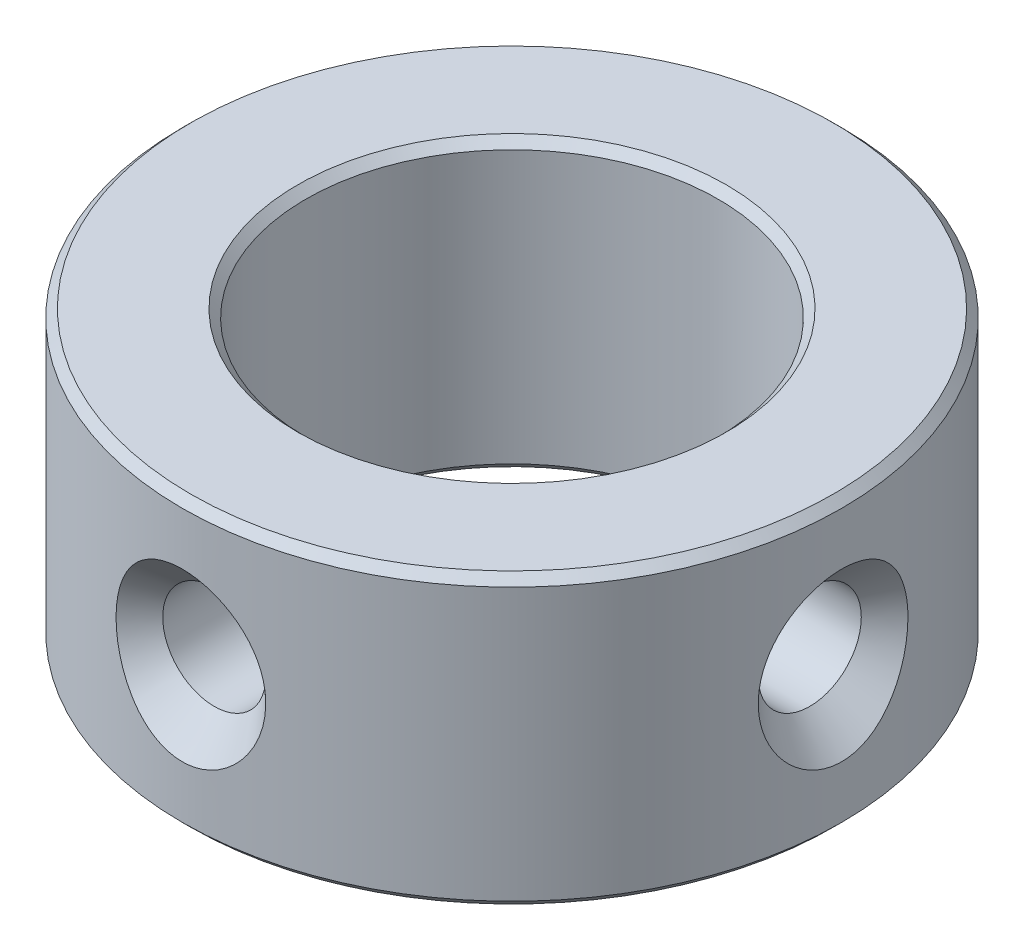
ISO-10303-21;
HEADER;
FILE_DESCRIPTION(('STEP AP214'),'2;1');
FILE_NAME('part.step','',(''),(''),'','','');
FILE_SCHEMA(('AUTOMOTIVE_DESIGN { 1 0 10303 214 1 1 1 1 }'));
ENDSEC;
DATA;
#1=APPLICATION_CONTEXT('core data for automotive mechanical design processes');
#2=APPLICATION_PROTOCOL_DEFINITION('international standard','automotive_design',2000,#1);
#3=PRODUCT_CONTEXT('',#1,'mechanical');
#4=PRODUCT('Part','Part','',(#3));
#5=PRODUCT_RELATED_PRODUCT_CATEGORY('part','',(#4));
#6=PRODUCT_DEFINITION_FORMATION('','',#4);
#7=PRODUCT_DEFINITION_CONTEXT('part definition',#1,'design');
#8=PRODUCT_DEFINITION('design','',#6,#7);
#9=PRODUCT_DEFINITION_SHAPE('','',#8);
#10=(LENGTH_UNIT() NAMED_UNIT(*) SI_UNIT(.MILLI.,.METRE.));
#11=(NAMED_UNIT(*) PLANE_ANGLE_UNIT() SI_UNIT($,.RADIAN.));
#12=(NAMED_UNIT(*) SI_UNIT($,.STERADIAN.) SOLID_ANGLE_UNIT());
#13=UNCERTAINTY_MEASURE_WITH_UNIT(LENGTH_MEASURE(1.E-05),#10,'distance_accuracy_value','');
#14=(GEOMETRIC_REPRESENTATION_CONTEXT(3) GLOBAL_UNCERTAINTY_ASSIGNED_CONTEXT((#13)) GLOBAL_UNIT_ASSIGNED_CONTEXT((#10,
#11,#12)) REPRESENTATION_CONTEXT('',''));
#15=CARTESIAN_POINT('',(0.,0.,0.));
#16=DIRECTION('',(0.,0.,1.));
#17=DIRECTION('',(1.,0.,0.));
#18=AXIS2_PLACEMENT_3D('',#15,#16,#17);
#19=CARTESIAN_POINT('',(0.,3.5,0.));
#20=DIRECTION('',(0.,1.,0.));
#21=DIRECTION('',(0.,0.,1.));
#22=AXIS2_PLACEMENT_3D('',#19,#20,#21);
#23=PLANE('',#22);
#24=CARTESIAN_POINT('',(0.,3.5,0.));
#25=DIRECTION('',(0.,1.,0.));
#26=DIRECTION('',(0.,0.,1.));
#27=AXIS2_PLACEMENT_3D('',#24,#25,#26);
#28=CIRCLE('',#27,5.19999999999999);
#29=CARTESIAN_POINT('',(0.,3.5,5.19999999999999));
#30=VERTEX_POINT('',#29);
#31=EDGE_CURVE('E39',#30,#30,#28,.F.);
#32=ORIENTED_EDGE('',*,*,#31,.T.);
#33=EDGE_LOOP('',(#32));
#34=FACE_BOUND('',#33,.T.);
#35=CARTESIAN_POINT('',(0.,3.5,0.));
#36=DIRECTION('',(0.,1.,0.));
#37=DIRECTION('',(0.,0.,1.));
#38=AXIS2_PLACEMENT_3D('',#35,#36,#37);
#39=CIRCLE('',#38,7.79999999999999);
#40=CARTESIAN_POINT('',(0.,3.5,7.79999999999999));
#41=VERTEX_POINT('',#40);
#42=EDGE_CURVE('E61',#41,#41,#39,.T.);
#43=ORIENTED_EDGE('',*,*,#42,.T.);
#44=EDGE_LOOP('',(#43));
#45=FACE_BOUND('',#44,.T.);
#46=ADVANCED_FACE('F32',(#34,#45),#23,.T.);
#47=CARTESIAN_POINT('',(0.,-3.5,0.));
#48=DIRECTION('',(0.,1.,0.));
#49=DIRECTION('',(0.,0.,1.));
#50=AXIS2_PLACEMENT_3D('',#47,#48,#49);
#51=PLANE('',#50);
#52=CARTESIAN_POINT('',(0.,-3.5,0.));
#53=DIRECTION('',(0.,1.,0.));
#54=DIRECTION('',(0.,0.,1.));
#55=AXIS2_PLACEMENT_3D('',#52,#53,#54);
#56=CIRCLE('',#55,5.2);
#57=CARTESIAN_POINT('',(0.,-3.5,5.2));
#58=VERTEX_POINT('',#57);
#59=EDGE_CURVE('E10',#58,#58,#56,.T.);
#60=ORIENTED_EDGE('',*,*,#59,.T.);
#61=EDGE_LOOP('',(#60));
#62=FACE_BOUND('',#61,.T.);
#63=CARTESIAN_POINT('',(0.,-3.5,0.));
#64=DIRECTION('',(0.,1.,0.));
#65=DIRECTION('',(0.,0.,1.));
#66=AXIS2_PLACEMENT_3D('',#63,#64,#65);
#67=CIRCLE('',#66,7.80000000000001);
#68=CARTESIAN_POINT('',(0.,-3.5,7.80000000000001));
#69=VERTEX_POINT('',#68);
#70=EDGE_CURVE('E52',#69,#69,#67,.F.);
#71=ORIENTED_EDGE('',*,*,#70,.T.);
#72=EDGE_LOOP('',(#71));
#73=FACE_BOUND('',#72,.T.);
#74=ADVANCED_FACE('F130',(#62,#73),#51,.F.);
#75=CARTESIAN_POINT('',(0.,3.5,0.));
#76=DIRECTION('',(0.,-1.,0.));
#77=DIRECTION('',(0.,0.,-1.));
#78=AXIS2_PLACEMENT_3D('',#75,#76,#77);
#79=CYLINDRICAL_SURFACE('',#78,8.);
#80=CARTESIAN_POINT('',(0.,3.3,0.));
#81=DIRECTION('',(0.,1.,0.));
#82=DIRECTION('',(0.,0.,1.));
#83=AXIS2_PLACEMENT_3D('',#80,#81,#82);
#84=CIRCLE('',#83,8.);
#85=CARTESIAN_POINT('',(0.,3.3,8.));
#86=VERTEX_POINT('',#85);
#87=EDGE_CURVE('E55',#86,#86,#84,.F.);
#88=ORIENTED_EDGE('',*,*,#87,.T.);
#89=EDGE_LOOP('',(#88));
#90=FACE_BOUND('',#89,.T.);
#91=CARTESIAN_POINT('',(0.,-3.30000000000001,0.));
#92=DIRECTION('',(0.,1.,0.));
#93=DIRECTION('',(0.,0.,1.));
#94=AXIS2_PLACEMENT_3D('',#91,#92,#93);
#95=CIRCLE('',#94,8.);
#96=CARTESIAN_POINT('',(0.,-3.30000000000001,8.));
#97=VERTEX_POINT('',#96);
#98=EDGE_CURVE('E58',#97,#97,#95,.T.);
#99=ORIENTED_EDGE('',*,*,#98,.T.);
#100=EDGE_LOOP('',(#99));
#101=FACE_BOUND('',#100,.T.);
#102=CARTESIAN_POINT('',(7.88766209710644,-1.36875477162574,-1.33595908059685));
#103=CARTESIAN_POINT('',(7.89781103552231,-1.4414286252341,-1.27603429818053));
#104=CARTESIAN_POINT('',(7.9081383203946,-1.50978786630845,-1.21092410711809));
#105=CARTESIAN_POINT('',(7.92828191149792,-1.63607735216326,-1.07113510455608));
#106=CARTESIAN_POINT('',(7.93809813738137,-1.69400596056068,-0.996454794813211));
#107=CARTESIAN_POINT('',(7.95751422673259,-1.80433598658457,-0.82826782927322));
#108=CARTESIAN_POINT('',(7.96691365686026,-1.85499227238431,-0.733577596470894));
#109=CARTESIAN_POINT('',(7.98262802779765,-1.93766030736591,-0.536115324437245));
#110=CARTESIAN_POINT('',(7.98894453445798,-1.96968152309718,-0.433347418805303));
#111=CARTESIAN_POINT('',(7.99710073240273,-2.01068415148824,-0.23484798397614));
#112=CARTESIAN_POINT('',(7.99935364163613,-2.02179796873598,-0.139571921445624));
#113=CARTESIAN_POINT('',(8.00040363119947,-2.02700021754694,0.0514400614488392));
#114=CARTESIAN_POINT('',(7.99920234256942,-2.02109668454089,0.147175743471714));
#115=CARTESIAN_POINT('',(7.99368299064805,-1.99353971527391,0.329953566160029));
#116=CARTESIAN_POINT('',(7.9895688820307,-1.97291623624104,0.417160436768698));
#117=CARTESIAN_POINT('',(7.97888924550496,-1.91805545357474,0.587003410573509));
#118=CARTESIAN_POINT('',(7.97232343057071,-1.88381655592824,0.669638977297495));
#119=CARTESIAN_POINT('',(7.95710684785922,-1.80164350628636,0.831447410075856));
#120=CARTESIAN_POINT('',(7.94838797996038,-1.75324988355686,0.910379354598936));
#121=CARTESIAN_POINT('',(7.92983729290104,-1.6451308494406,1.05989021924767));
#122=CARTESIAN_POINT('',(7.92000506202472,-1.58540124050917,1.13046602945358));
#123=CARTESIAN_POINT('',(7.89904582660171,-1.44972085183377,1.26905013470467));
#124=CARTESIAN_POINT('',(7.88789016769,-1.37273086647628,1.33603598461256));
#125=CARTESIAN_POINT('',(7.86633104820933,-1.20943589442853,1.45762002275963));
#126=CARTESIAN_POINT('',(7.85592793182822,-1.12312668986166,1.51221256681801));
#127=CARTESIAN_POINT('',(7.83578793922178,-0.93368420899724,1.61350064058194));
#128=CARTESIAN_POINT('',(7.82624234283822,-0.829739423354949,1.65872015787152));
#129=CARTESIAN_POINT('',(7.81024152158719,-0.615871494503479,1.73249973497609));
#130=CARTESIAN_POINT('',(7.80378723176595,-0.505946553622556,1.76105475474934));
#131=CARTESIAN_POINT('',(7.79436134890836,-0.275892694392124,1.80233745826448));
#132=CARTESIAN_POINT('',(7.79163227947352,-0.155555128118529,1.81396600486697));
#133=CARTESIAN_POINT('',(7.79075198907839,0.0854484195993427,1.81774165483045));
#134=CARTESIAN_POINT('',(7.79260142633618,0.206114445772796,1.80988595708527));
#135=CARTESIAN_POINT('',(7.80073010419386,0.446462607960986,1.77452638700267));
#136=CARTESIAN_POINT('',(7.80708299513201,0.566094443952362,1.74669574483184));
#137=CARTESIAN_POINT('',(7.82352991811995,0.798812680569081,1.67148212646728));
#138=CARTESIAN_POINT('',(7.83362448482233,0.911898143103936,1.62409635590782));
#139=CARTESIAN_POINT('',(7.85617363239958,1.12669357222183,1.51122432056163));
#140=CARTESIAN_POINT('',(7.86859876143102,1.22852268664282,1.44595970482076));
#141=CARTESIAN_POINT('',(7.89432126386702,1.41874134213551,1.29818903130757));
#142=CARTESIAN_POINT('',(7.90761843747953,1.50713394632294,1.21568691337547));
#143=CARTESIAN_POINT('',(7.93246835686329,1.66164276505291,1.04078913858743));
#144=CARTESIAN_POINT('',(7.94407815821557,1.72880219702167,0.949327337948772));
#145=CARTESIAN_POINT('',(7.96488454393579,1.84449878027027,0.75505110273021));
#146=CARTESIAN_POINT('',(7.97408378449348,1.89305645626681,0.652249342689261));
#147=CARTESIAN_POINT('',(7.98781799736742,1.96410335505809,0.451312314382522));
#148=CARTESIAN_POINT('',(7.99277458387603,1.98898855876391,0.354052486579373));
#149=CARTESIAN_POINT('',(7.99907701746182,2.02048546971918,0.156518181978604));
#150=CARTESIAN_POINT('',(8.00042540587232,2.02711003843476,0.0562458772972288));
#151=CARTESIAN_POINT('',(7.99938737297754,2.0219633323722,-0.134198642407214));
#152=CARTESIAN_POINT('',(7.99734430450829,2.01188339897859,-0.224423563772955));
#153=CARTESIAN_POINT('',(7.9903942901181,1.97699091937715,-0.401846849952557));
#154=CARTESIAN_POINT('',(7.98548742070105,1.95217876672711,-0.489045295550093));
#155=CARTESIAN_POINT('',(7.97332454700744,1.88894773394321,-0.658264871636935));
#156=CARTESIAN_POINT('',(7.96606573126401,1.85051256395271,-0.740279664771153));
#157=CARTESIAN_POINT('',(7.94991188720068,1.76159513342432,-0.897296732263518));
#158=CARTESIAN_POINT('',(7.94101638844481,1.71110940792094,-0.972296981040615));
#159=CARTESIAN_POINT('',(7.92157193605069,1.59495716503667,-1.12014915077485));
#160=CARTESIAN_POINT('',(7.91094652467704,1.52835569107497,-1.19225509057204));
#161=CARTESIAN_POINT('',(7.88970028540527,1.3850478979987,-1.32559327499721));
#162=CARTESIAN_POINT('',(7.8790794618174,1.3083369773454,-1.38682053797296));
#163=CARTESIAN_POINT('',(7.85762078250014,1.13766188456213,-1.50390740767079));
#164=CARTESIAN_POINT('',(7.84689440284181,1.04272763375916,-1.55837528669649));
#165=CARTESIAN_POINT('',(7.82769050557062,0.84543146813027,-1.65213681460813));
#166=CARTESIAN_POINT('',(7.8192138177182,0.743066830411459,-1.6914248671027));
#167=CARTESIAN_POINT('',(7.80478430221019,0.524863604563807,-1.75686338199667));
#168=CARTESIAN_POINT('',(7.79909327018633,0.408606654116868,-1.78168318673132));
#169=CARTESIAN_POINT('',(7.79197635299638,0.173492979797698,-1.81255498281006));
#170=CARTESIAN_POINT('',(7.79055134553896,0.0546357259951674,-1.81860311200533));
#171=CARTESIAN_POINT('',(7.79215470775396,-0.186141621833518,-1.8117236426872));
#172=CARTESIAN_POINT('',(7.79532022640392,-0.3080445698037,-1.798211677968));
#173=CARTESIAN_POINT('',(7.80597801834868,-0.547809265324001,-1.75136478762981));
#174=CARTESIAN_POINT('',(7.8134705945402,-0.665670729355821,-1.71802847428931));
#175=CARTESIAN_POINT('',(7.8312724761171,-0.886476919953176,-1.63488431518882));
#176=CARTESIAN_POINT('',(7.84136838501597,-0.989893398972423,-1.58628057084264));
#177=CARTESIAN_POINT('',(7.86344487841383,-1.18721070545209,-1.47294161599396));
#178=CARTESIAN_POINT('',(7.87542381944766,-1.28111971438651,-1.40822044388443));
#179=CARTESIAN_POINT('',(7.88766209710644,-1.36875477162574,-1.33595908059685));
#180=B_SPLINE_CURVE_WITH_KNOTS('',3,(#102,#103,#104,#105,#106,#107,#108,#109,#110,#111,#112,
#113,#114,#115,#116,#117,#118,#119,#120,#121,#122,#123,#124,#125,#126,#127,#128,#129,#130,#131,
#132,#133,#134,#135,#136,#137,#138,#139,#140,#141,#142,#143,#144,#145,#146,#147,#148,#149,#150,
#151,#152,#153,#154,#155,#156,#157,#158,#159,#160,#161,#162,#163,#164,#165,#166,#167,#168,#169,
#170,#171,#172,#173,#174,#175,#176,#177,#178,#179),.UNSPECIFIED.,.T.,.F.,(4,2,2,2,2,2,2,2,2,2,2,
2,2,2,2,2,2,2,2,2,2,2,2,2,2,2,2,2,2,2,2,2,2,2,2,2,2,2,4),(0.,0.28392792508048,0.567900354728612,
0.889441564156719,1.21081928888797,1.49713661535159,1.78331876764973,2.05122371140816,
2.31916002913897,2.59700085456465,2.87494476169208,3.18166689060421,3.48852842845147,
3.82831813350909,4.16821055201301,4.52931795360845,4.89047727196195,5.25768352956956,
5.62494227796447,5.98783937900106,6.35065362606252,6.6909135976671,7.03079704602511,
7.33066674892744,7.63032519134012,7.90145447436058,8.1725765147356,8.44402385178972,
8.71554933387908,9.01054345437876,9.3056723147691,9.63420252002207,9.96285373016412,
10.3182729082458,10.6737652066411,11.0400996569853,11.4064597540761,11.7491367222369,
12.0915162539504),.UNSPECIFIED.);
#181=CARTESIAN_POINT('',(7.88766209710644,-1.36875477162574,-1.33595908059685));
#182=VERTEX_POINT('',#181);
#183=EDGE_CURVE('E64',#182,#182,#180,.T.);
#184=ORIENTED_EDGE('',*,*,#183,.T.);
#185=EDGE_LOOP('',(#184));
#186=FACE_BOUND('',#185,.T.);
#187=CARTESIAN_POINT('',(-1.33595908059682,-1.36875477162574,7.88766209710644));
#188=CARTESIAN_POINT('',(-1.40944303777153,-1.27963328124012,7.87521663060979));
#189=CARTESIAN_POINT('',(-1.4751754482527,-1.18396169283024,7.8630310480242));
#190=CARTESIAN_POINT('',(-1.58998478810417,-0.982768950640019,7.8406243495173));
#191=CARTESIAN_POINT('',(-1.63903097970948,-0.877230071127629,7.83040687390907));
#192=CARTESIAN_POINT('',(-1.7197846566863,-0.659040217468571,7.81306964438267));
#193=CARTESIAN_POINT('',(-1.75142909299779,-0.546365009691055,7.80596117361972));
#194=CARTESIAN_POINT('',(-1.7966083868814,-0.317327894439627,7.79568713804951));
#195=CARTESIAN_POINT('',(-1.81015004894302,-0.20096738904467,7.79252009176648));
#196=CARTESIAN_POINT('',(-1.81912690093356,0.0375541003684798,7.79043051240186));
#197=CARTESIAN_POINT('',(-1.81375255546961,0.159748051786066,7.7916977364872));
#198=CARTESIAN_POINT('',(-1.78316985558781,0.401526905792244,7.79875284080626));
#199=CARTESIAN_POINT('',(-1.7579562950191,0.521111115072941,7.80454190764629));
#200=CARTESIAN_POINT('',(-1.68797509817015,0.754678135856541,7.81997590276495));
#201=CARTESIAN_POINT('',(-1.64313222537074,0.868637499222224,7.82963565468714));
#202=CARTESIAN_POINT('',(-1.53459227889633,1.08697091740285,7.85162918503102));
#203=CARTESIAN_POINT('',(-1.47089394056544,1.19134432866246,7.86396314279966));
#204=CARTESIAN_POINT('',(-1.32787380544344,1.38394389747925,7.88935093709948));
#205=CARTESIAN_POINT('',(-1.24906617594473,1.47255445402449,7.9023729646794));
#206=CARTESIAN_POINT('',(-1.07624454948179,1.63361969726082,7.92775432716441));
#207=CARTESIAN_POINT('',(-0.982240552060119,1.70608493385718,7.94011409078095));
#208=CARTESIAN_POINT('',(-0.79061247210154,1.82538818356649,7.96136628250515));
#209=CARTESIAN_POINT('',(-0.69409294335025,1.87395619323951,7.97047169136296));
#210=CARTESIAN_POINT('',(-0.493362812086154,1.95187494459024,7.98540336949179));
#211=CARTESIAN_POINT('',(-0.389160830878532,1.98124687368938,7.99123325307974));
#212=CARTESIAN_POINT('',(-0.189694909948285,2.01661473852397,7.99829721116927));
#213=CARTESIAN_POINT('',(-0.0948670486129899,2.02500106783029,8.0000004438111));
#214=CARTESIAN_POINT('',(0.0947751515084338,2.02499893199174,7.99999955623128));
#215=CARTESIAN_POINT('',(0.189589483759011,2.01661622526808,7.99829660567961));
#216=CARTESIAN_POINT('',(0.370809730932551,1.98451694841217,7.99188722859812));
#217=CARTESIAN_POINT('',(0.457385809552344,1.96170874588219,7.98735892720726));
#218=CARTESIAN_POINT('',(0.625658222200896,1.90269415719664,7.97594322581105));
#219=CARTESIAN_POINT('',(0.707353931616675,1.86648606030711,7.96905552459485));
#220=CARTESIAN_POINT('',(0.867569492170292,1.78026547187512,7.95324421338002));
#221=CARTESIAN_POINT('',(0.945791217111726,1.72971545485633,7.9442443268816));
#222=CARTESIAN_POINT('',(1.09358950647522,1.61742972276801,7.92525239714604));
#223=CARTESIAN_POINT('',(1.16316271346547,1.55568968635356,7.91525997128766));
#224=CARTESIAN_POINT('',(1.29954042216669,1.41578666349428,7.89407723621862));
#225=CARTESIAN_POINT('',(1.36526761175843,1.33657615589086,7.88287233695986));
#226=CARTESIAN_POINT('',(1.48400187279958,1.16902916281141,7.86138577229738));
#227=CARTESIAN_POINT('',(1.53700319890389,1.08068858102978,7.85110452520086));
#228=CARTESIAN_POINT('',(1.63450481137137,0.887403707645067,7.83141963516629));
#229=CARTESIAN_POINT('',(1.67752592730855,0.781690202917847,7.82222183509354));
#230=CARTESIAN_POINT('',(1.74661069991577,0.564638279797977,7.80708679845405));
#231=CARTESIAN_POINT('',(1.77266951557473,0.453298265370823,7.80115049278747));
#232=CARTESIAN_POINT('',(1.80845440681822,0.221213054972745,7.79293665356938));
#233=CARTESIAN_POINT('',(1.81714026649163,0.100297867187098,7.79089247887507));
#234=CARTESIAN_POINT('',(1.81492795759776,-0.14135115663399,7.79140775037289));
#235=CARTESIAN_POINT('',(1.80402704622598,-0.262084964900686,7.7939678413166));
#236=CARTESIAN_POINT('',(1.76252654275359,-0.501730670074366,7.80345808549174));
#237=CARTESIAN_POINT('',(1.7316488081271,-0.620592183231181,7.81044991465534));
#238=CARTESIAN_POINT('',(1.65043457115164,-0.851232621719874,7.82801267019195));
#239=CARTESIAN_POINT('',(1.60009536179655,-0.963010559238733,7.83858409444561));
#240=CARTESIAN_POINT('',(1.48165145405798,-1.17437241089617,7.86182474204769));
#241=CARTESIAN_POINT('',(1.41381486637922,-1.27410960320468,7.87446133375991));
#242=CARTESIAN_POINT('',(1.26120217541879,-1.45963714957304,7.90033767731509));
#243=CARTESIAN_POINT('',(1.17643106707287,-1.54543160262501,7.9135772504183));
#244=CARTESIAN_POINT('',(0.998011107973364,-1.69401401433269,7.93797921346679));
#245=CARTESIAN_POINT('',(0.90534288426297,-1.75796127121415,7.94922142034198));
#246=CARTESIAN_POINT('',(0.709272827989419,-1.86703609042369,7.96910186557969));
#247=CARTESIAN_POINT('',(0.605883243087173,-1.91218483795794,7.97774303215506));
#248=CARTESIAN_POINT('',(0.404716248952393,-1.97672877790154,7.99031415496274));
#249=CARTESIAN_POINT('',(0.307745877773974,-1.9985577744658,7.99468387782547));
#250=CARTESIAN_POINT('',(0.11137486601841,-2.02417709809171,7.99982573772534));
#251=CARTESIAN_POINT('',(0.0119759014518737,-2.02797953080607,8.00060028907539));
#252=CARTESIAN_POINT('',(-0.176892672327146,-2.01782244033892,7.99855206823825));
#253=CARTESIAN_POINT('',(-0.266454487385794,-2.00542272030253,7.99604516687026));
#254=CARTESIAN_POINT('',(-0.442220820235402,-1.96614357552015,7.98825273168375));
#255=CARTESIAN_POINT('',(-0.528424674856496,-1.93926130597916,7.98296665195849));
#256=CARTESIAN_POINT('',(-0.696088816247197,-1.87192858562971,7.97010727109852));
#257=CARTESIAN_POINT('',(-0.777496193837674,-1.83135152945414,7.96251269602614));
#258=CARTESIAN_POINT('',(-0.932957494013871,-1.73832233512111,7.94579796801077));
#259=CARTESIAN_POINT('',(-1.00701547317598,-1.68587680092784,7.93667866420511));
#260=CARTESIAN_POINT('',(-1.12407234615611,-1.58941372147517,7.92077931438588));
#261=CARTESIAN_POINT('',(-1.16938805142687,-1.54812863237362,7.91419273924553));
#262=CARTESIAN_POINT('',(-1.25584865520945,-1.46142780527151,7.90093378320774));
#263=CARTESIAN_POINT('',(-1.29699363239536,-1.4160121452182,7.89426140393154));
#264=CARTESIAN_POINT('',(-1.33595908059682,-1.36875477162574,7.88766209710644));
#265=B_SPLINE_CURVE_WITH_KNOTS('',3,(#187,#188,#189,#190,#191,#192,#193,#194,#195,#196,#197,
#198,#199,#200,#201,#202,#203,#204,#205,#206,#207,#208,#209,#210,#211,#212,#213,#214,#215,#216,
#217,#218,#219,#220,#221,#222,#223,#224,#225,#226,#227,#228,#229,#230,#231,#232,#233,#234,#235,
#236,#237,#238,#239,#240,#241,#242,#243,#244,#245,#246,#247,#248,#249,#250,#251,#252,#253,#254,
#255,#256,#257,#258,#259,#260,#261,#262,#263,#264),.UNSPECIFIED.,.T.,.F.,(4,2,2,2,2,2,2,2,2,2,2,
2,2,2,2,2,2,2,2,2,2,2,2,2,2,2,2,2,2,2,2,2,2,2,2,2,2,2,4),(0.,0.348306093920295,
0.697250373470942,1.04745073564415,1.39751942709634,1.7627485627584,2.12807357279693,
2.49481125585327,2.86157354196718,3.21755719577478,3.5733075509734,3.89674166179198,
4.21981818086019,4.50396250994394,4.78800928172883,5.05574157516836,5.32350806117745,
5.60306209803105,5.88272432356568,6.19206433026372,6.50154373318356,6.84355348581516,
7.18566080468985,7.54770319795976,7.90979629325175,8.2770426765485,8.64434016060228,
9.00631322017014,9.3681796708921,9.70570674455812,10.0428524016858,10.3396868480256,
10.6363219283492,10.9063983305383,11.1765278029609,11.4492262728374,11.7217733768772,
11.9064689165211,12.0911609715316),.UNSPECIFIED.);
#266=CARTESIAN_POINT('',(-1.33595908059682,-1.36875477162574,7.88766209710644));
#267=VERTEX_POINT('',#266);
#268=EDGE_CURVE('E72',#267,#267,#265,.T.);
#269=ORIENTED_EDGE('',*,*,#268,.T.);
#270=EDGE_LOOP('',(#269));
#271=FACE_BOUND('',#270,.T.);
#272=ADVANCED_FACE('F78',(#90,#101,#186,#271),#79,.T.);
#273=CARTESIAN_POINT('',(0.,3.5,0.));
#274=DIRECTION('',(0.,-1.,0.));
#275=DIRECTION('',(0.,0.,-1.));
#276=AXIS2_PLACEMENT_3D('',#273,#274,#275);
#277=CYLINDRICAL_SURFACE('',#276,5.);
#278=CARTESIAN_POINT('',(0.,3.30000000000001,0.));
#279=DIRECTION('',(0.,1.,0.));
#280=DIRECTION('',(0.,0.,1.));
#281=AXIS2_PLACEMENT_3D('',#278,#279,#280);
#282=CIRCLE('',#281,5.);
#283=CARTESIAN_POINT('',(0.,3.30000000000001,5.));
#284=VERTEX_POINT('',#283);
#285=EDGE_CURVE('E43',#284,#284,#282,.T.);
#286=ORIENTED_EDGE('',*,*,#285,.T.);
#287=EDGE_LOOP('',(#286));
#288=FACE_BOUND('',#287,.T.);
#289=CARTESIAN_POINT('',(0.,-3.3,0.));
#290=DIRECTION('',(0.,1.,0.));
#291=DIRECTION('',(0.,0.,1.));
#292=AXIS2_PLACEMENT_3D('',#289,#290,#291);
#293=CIRCLE('',#292,5.);
#294=CARTESIAN_POINT('',(0.,-3.3,5.));
#295=VERTEX_POINT('',#294);
#296=EDGE_CURVE('E47',#295,#295,#293,.F.);
#297=ORIENTED_EDGE('',*,*,#296,.T.);
#298=EDGE_LOOP('',(#297));
#299=FACE_BOUND('',#298,.T.);
#300=CARTESIAN_POINT('',(4.84122918275927,0.,-1.25000000000002));
#301=CARTESIAN_POINT('',(4.84123050042654,-0.0690253754623046,-1.2499980392959));
#302=CARTESIAN_POINT('',(4.84272153006956,-0.138072449338997,-1.24426312274867));
#303=CARTESIAN_POINT('',(4.84850930996624,-0.274183789087018,-1.22151156273209));
#304=CARTESIAN_POINT('',(4.85280769310906,-0.341246877234163,-1.20448835337111));
#305=CARTESIAN_POINT('',(4.86369362297983,-0.47140176909352,-1.15974559981599));
#306=CARTESIAN_POINT('',(4.87027821345204,-0.534498577692835,-1.13203986392725));
#307=CARTESIAN_POINT('',(4.88499096014404,-0.655155426269959,-1.06676057063072));
#308=CARTESIAN_POINT('',(4.89311918189251,-0.712715231040113,-1.02918659428036));
#309=CARTESIAN_POINT('',(4.91020358177805,-0.821930822631102,-0.944354213655954));
#310=CARTESIAN_POINT('',(4.91917298811515,-0.873446800175021,-0.896918443852041));
#311=CARTESIAN_POINT('',(4.93681437757648,-0.96788069718017,-0.794091032050349));
#312=CARTESIAN_POINT('',(4.94548633283194,-1.01079781281087,-0.73869864709017));
#313=CARTESIAN_POINT('',(4.96170207760291,-1.08738773381564,-0.620572600539494));
#314=CARTESIAN_POINT('',(4.96922843700296,-1.12092319408073,-0.557747288097577));
#315=CARTESIAN_POINT('',(4.98215405962992,-1.17690482207654,-0.427131592146398));
#316=CARTESIAN_POINT('',(4.98755363667172,-1.19935262595776,-0.359341942895987));
#317=CARTESIAN_POINT('',(4.9955237942409,-1.23207391728929,-0.222179379377098));
#318=CARTESIAN_POINT('',(4.99814946922157,-1.24258482216329,-0.152866359774505));
#319=CARTESIAN_POINT('',(5.00046797053649,-1.25187918963778,-0.0134144096314022));
#320=CARTESIAN_POINT('',(5.00016123048352,-1.2506643861048,0.0567243972690167));
#321=CARTESIAN_POINT('',(4.99669047476767,-1.23671257487493,0.194190308965466));
#322=CARTESIAN_POINT('',(4.99359001170437,-1.22423183747307,0.261545269501316));
#323=CARTESIAN_POINT('',(4.98495418262427,-1.18851436497575,0.39317280926709));
#324=CARTESIAN_POINT('',(4.97941868699221,-1.16527705731129,0.45744522421303));
#325=CARTESIAN_POINT('',(4.96643754850448,-1.10849871465647,0.58175837937724));
#326=CARTESIAN_POINT('',(4.95897509847527,-1.07486647766913,0.641755637208112));
#327=CARTESIAN_POINT('',(4.94294951904825,-0.99832216044187,0.755344527925593));
#328=CARTESIAN_POINT('',(4.93438619826245,-0.955408465719689,0.808935043856864));
#329=CARTESIAN_POINT('',(4.91681856884761,-0.860145629008811,0.909717543856177));
#330=CARTESIAN_POINT('',(4.90780859762959,-0.807572553826113,0.956697098843981));
#331=CARTESIAN_POINT('',(4.89057521758354,-0.695200013229874,1.04122046995376));
#332=CARTESIAN_POINT('',(4.88235184552986,-0.635400210254499,1.0787638450575));
#333=CARTESIAN_POINT('',(4.86760248415825,-0.509854982925517,1.14348516127823));
#334=CARTESIAN_POINT('',(4.86108491862861,-0.444082134843402,1.1706119587131));
#335=CARTESIAN_POINT('',(4.85059320069979,-0.308707265961774,1.21335702579541));
#336=CARTESIAN_POINT('',(4.8466185040511,-0.239106068008432,1.22897775819112));
#337=CARTESIAN_POINT('',(4.84177678019571,-0.10002024923844,1.24791481933257));
#338=CARTESIAN_POINT('',(4.84083044546824,-0.0305811033351858,1.2515452369598));
#339=CARTESIAN_POINT('',(4.8419367174052,0.107910968289079,1.24725849525776));
#340=CARTESIAN_POINT('',(4.84398904800633,0.17696392897562,1.23934239892438));
#341=CARTESIAN_POINT('',(4.85078540977281,0.311557132477353,1.21246273196881));
#342=CARTESIAN_POINT('',(4.85548485117188,0.377136363285422,1.19368203414085));
#343=CARTESIAN_POINT('',(4.86700359135482,0.504215728925841,1.14580904083529));
#344=CARTESIAN_POINT('',(4.87382314124307,0.56571537952767,1.11671552385625));
#345=CARTESIAN_POINT('',(4.88898068546632,0.684220638933674,1.04838533396826));
#346=CARTESIAN_POINT('',(4.89734584303321,0.741114420021551,1.0089608769178));
#347=CARTESIAN_POINT('',(4.91458541535858,0.847594181400676,0.921325366168051));
#348=CARTESIAN_POINT('',(4.92345991364235,0.897178958325036,0.873112868506781));
#349=CARTESIAN_POINT('',(4.94098701515803,0.988905521285478,0.767828401230889));
#350=CARTESIAN_POINT('',(4.94962851030918,1.03083003127441,0.710564940664473));
#351=CARTESIAN_POINT('',(4.96548608306867,1.10446793347562,0.589628353368326));
#352=CARTESIAN_POINT('',(4.9727022350198,1.1361818583041,0.525955561196971));
#353=CARTESIAN_POINT('',(4.98485057869157,1.18822301726396,0.394447752163845));
#354=CARTESIAN_POINT('',(4.98979915011205,1.20863214218953,0.326646726284834));
#355=CARTESIAN_POINT('',(4.99692646697894,1.23773016730421,0.188437200398492));
#356=CARTESIAN_POINT('',(4.99910574696704,1.24642132936952,0.118029206301537));
#357=CARTESIAN_POINT('',(5.00042711761014,1.25170948696942,-0.0213544080541755));
#358=CARTESIAN_POINT('',(4.9996497360001,1.24862713636924,-0.0903172837075588));
#359=CARTESIAN_POINT('',(4.99532370571779,1.23119021588208,-0.226709370518442));
#360=CARTESIAN_POINT('',(4.99177513946369,1.21683598123362,-0.294138627226125));
#361=CARTESIAN_POINT('',(4.98231791067453,1.17743472528634,-0.425213794556037));
#362=CARTESIAN_POINT('',(4.97642205628333,1.15244568335672,-0.488878118226291));
#363=CARTESIAN_POINT('',(4.9628911114173,1.09253677622584,-0.611146316301852));
#364=CARTESIAN_POINT('',(4.9552558017217,1.05761565916304,-0.669749551581331));
#365=CARTESIAN_POINT('',(4.93884062101666,0.977855957503657,-0.781752410529891));
#366=CARTESIAN_POINT('',(4.93003771182014,0.932799821365776,-0.834993735375747));
#367=CARTESIAN_POINT('',(4.91238311316552,0.834471435032751,-0.933268775339085));
#368=CARTESIAN_POINT('',(4.90353141190694,0.781197104877616,-0.978300406335253));
#369=CARTESIAN_POINT('',(4.88659344825685,0.666748232248333,-1.05970253309905));
#370=CARTESIAN_POINT('',(4.87852454662355,0.605444845734214,-1.0958957743082));
#371=CARTESIAN_POINT('',(4.86429944438269,0.477430637596623,-1.1574086207696));
#372=CARTESIAN_POINT('',(4.85814185308378,0.410723792366572,-1.18273613719966));
#373=CARTESIAN_POINT('',(4.84939885924729,0.286778735216604,-1.21802816070681));
#374=CARTESIAN_POINT('',(4.84635828750683,0.230133544520173,-1.22999146324424));
#375=CARTESIAN_POINT('',(4.84227298231965,0.115663913750045,-1.2459778657166));
#376=CARTESIAN_POINT('',(4.84122807862453,0.0578395746936729,-1.25000164296525));
#377=CARTESIAN_POINT('',(4.84122918275927,0.,-1.25000000000002));
#378=B_SPLINE_CURVE_WITH_KNOTS('',3,(#300,#301,#302,#303,#304,#305,#306,#307,#308,#309,#310,
#311,#312,#313,#314,#315,#316,#317,#318,#319,#320,#321,#322,#323,#324,#325,#326,#327,#328,#329,
#330,#331,#332,#333,#334,#335,#336,#337,#338,#339,#340,#341,#342,#343,#344,#345,#346,#347,#348,
#349,#350,#351,#352,#353,#354,#355,#356,#357,#358,#359,#360,#361,#362,#363,#364,#365,#366,#367,
#368,#369,#370,#371,#372,#373,#374,#375,#376,#377),.UNSPECIFIED.,.T.,.F.,(4,2,2,2,2,2,2,2,2,2,2,
2,2,2,2,2,2,2,2,2,2,2,2,2,2,2,2,2,2,2,2,2,2,2,2,2,2,2,4),(0.,0.206863720868068,
0.413847870714333,0.62056536358301,0.827291633777392,1.03811977096488,1.24896760739933,
1.4627574819896,1.67651579923546,1.88594375497673,2.0953407433301,2.30009131344473,
2.50485278362393,2.71146437127222,2.91811192734456,3.13035233285956,3.34260265599901,
3.55588216004201,3.76911600064773,3.97671787380858,4.18430063591901,4.38848702504603,
4.59269760710708,4.80091422929578,5.00916509442522,5.22262665482659,5.43607707859776,
5.64796036403464,5.85980274454519,6.06591723063728,6.2720255868849,6.47702438279855,
6.68204902869036,6.89198548291035,7.10197515782754,7.31588238642338,7.52963360683309,
7.70298913588664,7.8763298754976),.UNSPECIFIED.);
#379=CARTESIAN_POINT('',(4.84122918275927,0.,-1.25000000000002));
#380=VERTEX_POINT('',#379);
#381=EDGE_CURVE('E96',#380,#380,#378,.T.);
#382=ORIENTED_EDGE('',*,*,#381,.F.);
#383=EDGE_LOOP('',(#382));
#384=FACE_BOUND('',#383,.T.);
#385=CARTESIAN_POINT('',(1.25,0.,4.84122918275927));
#386=CARTESIAN_POINT('',(1.24999803929589,-0.0690253754623047,4.84123050042654));
#387=CARTESIAN_POINT('',(1.24426312274865,-0.138072449338997,4.84272153006957));
#388=CARTESIAN_POINT('',(1.22151156273207,-0.274183789087018,4.84850930996624));
#389=CARTESIAN_POINT('',(1.2044883533711,-0.341246877234163,4.85280769310907));
#390=CARTESIAN_POINT('',(1.15974559981597,-0.47140176909352,4.86369362297984));
#391=CARTESIAN_POINT('',(1.13203986392723,-0.534498577692834,4.87027821345204));
#392=CARTESIAN_POINT('',(1.0667605706307,-0.655155426269959,4.88499096014404));
#393=CARTESIAN_POINT('',(1.02918659428035,-0.712715231040113,4.89311918189251));
#394=CARTESIAN_POINT('',(0.944354213655936,-0.821930822631102,4.91020358177806));
#395=CARTESIAN_POINT('',(0.896918443852023,-0.873446800175022,4.91917298811515));
#396=CARTESIAN_POINT('',(0.794091032050331,-0.96788069718017,4.93681437757649));
#397=CARTESIAN_POINT('',(0.738698647090153,-1.01079781281087,4.94548633283195));
#398=CARTESIAN_POINT('',(0.620572600539477,-1.08738773381564,4.96170207760291));
#399=CARTESIAN_POINT('',(0.55774728809756,-1.12092319408073,4.96922843700296));
#400=CARTESIAN_POINT('',(0.427131592146381,-1.17690482207654,4.98215405962992));
#401=CARTESIAN_POINT('',(0.35934194289597,-1.19935262595776,4.98755363667172));
#402=CARTESIAN_POINT('',(0.222179379377081,-1.23207391728929,4.9955237942409));
#403=CARTESIAN_POINT('',(0.152866359774488,-1.24258482216329,4.99814946922157));
#404=CARTESIAN_POINT('',(0.0134144096313849,-1.25187918963778,5.00046797053649));
#405=CARTESIAN_POINT('',(-0.056724397269034,-1.2506643861048,5.00016123048352));
#406=CARTESIAN_POINT('',(-0.194190308965484,-1.23671257487493,4.99669047476767));
#407=CARTESIAN_POINT('',(-0.261545269501333,-1.22423183747307,4.99359001170437));
#408=CARTESIAN_POINT('',(-0.393172809267107,-1.18851436497575,4.98495418262427));
#409=CARTESIAN_POINT('',(-0.457445224213047,-1.16527705731129,4.9794186869922));
#410=CARTESIAN_POINT('',(-0.581758379377257,-1.10849871465647,4.96643754850448));
#411=CARTESIAN_POINT('',(-0.64175563720813,-1.07486647766913,4.95897509847527));
#412=CARTESIAN_POINT('',(-0.75534452792561,-0.99832216044187,4.94294951904825));
#413=CARTESIAN_POINT('',(-0.808935043856881,-0.955408465719689,4.93438619826245));
#414=CARTESIAN_POINT('',(-0.909717543856194,-0.860145629008811,4.9168185688476));
#415=CARTESIAN_POINT('',(-0.956697098843998,-0.807572553826113,4.90780859762959));
#416=CARTESIAN_POINT('',(-1.04122046995377,-0.695200013229874,4.89057521758353));
#417=CARTESIAN_POINT('',(-1.07876384505752,-0.6354002102545,4.88235184552985));
#418=CARTESIAN_POINT('',(-1.14348516127825,-0.509854982925517,4.86760248415824));
#419=CARTESIAN_POINT('',(-1.17061195871311,-0.444082134843402,4.8610849186286));
#420=CARTESIAN_POINT('',(-1.21335702579542,-0.308707265961774,4.85059320069978));
#421=CARTESIAN_POINT('',(-1.22897775819114,-0.239106068008432,4.84661850405109));
#422=CARTESIAN_POINT('',(-1.24791481933259,-0.10002024923844,4.8417767801957));
#423=CARTESIAN_POINT('',(-1.25154523695981,-0.0305811033351859,4.84083044546824));
#424=CARTESIAN_POINT('',(-1.24725849525777,0.107910968289079,4.8419367174052));
#425=CARTESIAN_POINT('',(-1.2393423989244,0.17696392897562,4.84398904800633));
#426=CARTESIAN_POINT('',(-1.21246273196883,0.311557132477353,4.8507854097728));
#427=CARTESIAN_POINT('',(-1.19368203414087,0.377136363285421,4.85548485117188));
#428=CARTESIAN_POINT('',(-1.14580904083531,0.504215728925841,4.86700359135481));
#429=CARTESIAN_POINT('',(-1.11671552385627,0.565715379527669,4.87382314124307));
#430=CARTESIAN_POINT('',(-1.04838533396828,0.684220638933674,4.88898068546631));
#431=CARTESIAN_POINT('',(-1.00896087691781,0.74111442002155,4.89734584303321));
#432=CARTESIAN_POINT('',(-0.921325366168069,0.847594181400676,4.91458541535858));
#433=CARTESIAN_POINT('',(-0.873112868506798,0.897178958325036,4.92345991364235));
#434=CARTESIAN_POINT('',(-0.767828401230907,0.988905521285477,4.94098701515803));
#435=CARTESIAN_POINT('',(-0.71056494066449,1.03083003127441,4.94962851030918));
#436=CARTESIAN_POINT('',(-0.589628353368344,1.10446793347562,4.96548608306867));
#437=CARTESIAN_POINT('',(-0.525955561196989,1.1361818583041,4.9727022350198));
#438=CARTESIAN_POINT('',(-0.394447752163863,1.18822301726396,4.98485057869157));
#439=CARTESIAN_POINT('',(-0.326646726284852,1.20863214218953,4.98979915011205));
#440=CARTESIAN_POINT('',(-0.18843720039851,1.23773016730421,4.99692646697894));
#441=CARTESIAN_POINT('',(-0.118029206301555,1.24642132936952,4.99910574696704));
#442=CARTESIAN_POINT('',(0.0213544080541577,1.25170948696942,5.00042711761014));
#443=CARTESIAN_POINT('',(0.0903172837075411,1.24862713636924,4.9996497360001));
#444=CARTESIAN_POINT('',(0.226709370518424,1.23119021588208,4.9953237057178));
#445=CARTESIAN_POINT('',(0.294138627226108,1.21683598123362,4.99177513946369));
#446=CARTESIAN_POINT('',(0.42521379455602,1.17743472528634,4.98231791067453));
#447=CARTESIAN_POINT('',(0.488878118226273,1.15244568335672,4.97642205628333));
#448=CARTESIAN_POINT('',(0.611146316301835,1.09253677622584,4.9628911114173));
#449=CARTESIAN_POINT('',(0.669749551581313,1.05761565916304,4.9552558017217));
#450=CARTESIAN_POINT('',(0.781752410529873,0.977855957503657,4.93884062101666));
#451=CARTESIAN_POINT('',(0.834993735375729,0.932799821365777,4.93003771182014));
#452=CARTESIAN_POINT('',(0.933268775339068,0.834471435032752,4.91238311316553));
#453=CARTESIAN_POINT('',(0.978300406335236,0.781197104877617,4.90353141190695));
#454=CARTESIAN_POINT('',(1.05970253309903,0.666748232248334,4.88659344825685));
#455=CARTESIAN_POINT('',(1.09589577430819,0.605444845734215,4.87852454662356));
#456=CARTESIAN_POINT('',(1.15740862076958,0.477430637596623,4.8642994443827));
#457=CARTESIAN_POINT('',(1.18273613719965,0.410723792366572,4.85814185308378));
#458=CARTESIAN_POINT('',(1.2180281607068,0.286778735216605,4.84939885924729));
#459=CARTESIAN_POINT('',(1.22999146324422,0.230133544520174,4.84635828750683));
#460=CARTESIAN_POINT('',(1.24597786571658,0.115663913750045,4.84227298231965));
#461=CARTESIAN_POINT('',(1.25000164296523,0.0578395746936729,4.84122807862454));
#462=CARTESIAN_POINT('',(1.25,0.,4.84122918275927));
#463=B_SPLINE_CURVE_WITH_KNOTS('',3,(#385,#386,#387,#388,#389,#390,#391,#392,#393,#394,#395,
#396,#397,#398,#399,#400,#401,#402,#403,#404,#405,#406,#407,#408,#409,#410,#411,#412,#413,#414,
#415,#416,#417,#418,#419,#420,#421,#422,#423,#424,#425,#426,#427,#428,#429,#430,#431,#432,#433,
#434,#435,#436,#437,#438,#439,#440,#441,#442,#443,#444,#445,#446,#447,#448,#449,#450,#451,#452,
#453,#454,#455,#456,#457,#458,#459,#460,#461,#462),.UNSPECIFIED.,.T.,.F.,(4,2,2,2,2,2,2,2,2,2,2,
2,2,2,2,2,2,2,2,2,2,2,2,2,2,2,2,2,2,2,2,2,2,2,2,2,2,2,4),(0.,0.206863720868068,
0.413847870714333,0.62056536358301,0.827291633777392,1.03811977096488,1.24896760739933,
1.4627574819896,1.67651579923546,1.88594375497673,2.0953407433301,2.30009131344473,
2.50485278362393,2.71146437127222,2.91811192734456,3.13035233285956,3.34260265599901,
3.55588216004201,3.76911600064773,3.97671787380858,4.18430063591901,4.38848702504603,
4.59269760710708,4.80091422929578,5.00916509442522,5.22262665482659,5.43607707859776,
5.64796036403464,5.85980274454519,6.06591723063728,6.2720255868849,6.47702438279855,
6.68204902869036,6.89198548291035,7.10197515782754,7.31588238642338,7.52963360683309,
7.70298913588664,7.8763298754976),.UNSPECIFIED.);
#464=CARTESIAN_POINT('',(1.25,0.,4.84122918275927));
#465=VERTEX_POINT('',#464);
#466=EDGE_CURVE('E106',#465,#465,#463,.T.);
#467=ORIENTED_EDGE('',*,*,#466,.F.);
#468=EDGE_LOOP('',(#467));
#469=FACE_BOUND('',#468,.T.);
#470=ADVANCED_FACE('F121',(#288,#299,#384,#469),#277,.F.);
#471=CARTESIAN_POINT('',(0.,0.,8.));
#472=DIRECTION('',(0.,0.,1.));
#473=DIRECTION('',(1.,0.,0.));
#474=AXIS2_PLACEMENT_3D('',#471,#472,#473);
#475=CONICAL_SURFACE('',#474,2.025,0.785398163397449);
#476=CARTESIAN_POINT('',(0.,0.,7.225));
#477=DIRECTION('',(0.,0.,1.));
#478=DIRECTION('',(1.,0.,0.));
#479=AXIS2_PLACEMENT_3D('',#476,#477,#478);
#480=CIRCLE('',#479,1.25);
#481=CARTESIAN_POINT('',(1.25,0.,7.225));
#482=VERTEX_POINT('',#481);
#483=EDGE_CURVE('E103',#482,#482,#480,.T.);
#484=ORIENTED_EDGE('',*,*,#483,.F.);
#485=EDGE_LOOP('',(#484));
#486=FACE_BOUND('',#485,.T.);
#487=ORIENTED_EDGE('',*,*,#268,.F.);
#488=EDGE_LOOP('',(#487));
#489=FACE_BOUND('',#488,.T.);
#490=ADVANCED_FACE('F117',(#486,#489),#475,.F.);
#491=CARTESIAN_POINT('',(0.,0.,8.));
#492=DIRECTION('',(0.,0.,1.));
#493=DIRECTION('',(1.,0.,0.));
#494=AXIS2_PLACEMENT_3D('',#491,#492,#493);
#495=CYLINDRICAL_SURFACE('',#494,1.25);
#496=ORIENTED_EDGE('',*,*,#483,.T.);
#497=EDGE_LOOP('',(#496));
#498=FACE_BOUND('',#497,.T.);
#499=ORIENTED_EDGE('',*,*,#466,.T.);
#500=EDGE_LOOP('',(#499));
#501=FACE_BOUND('',#500,.T.);
#502=ADVANCED_FACE('F87',(#498,#501),#495,.F.);
#503=CARTESIAN_POINT('',(8.,0.,0.));
#504=DIRECTION('',(1.,0.,0.));
#505=DIRECTION('',(0.,0.,-1.));
#506=AXIS2_PLACEMENT_3D('',#503,#504,#505);
#507=CONICAL_SURFACE('',#506,2.025,0.785398163397449);
#508=CARTESIAN_POINT('',(7.225,0.,0.));
#509=DIRECTION('',(1.,0.,0.));
#510=DIRECTION('',(0.,0.,-1.));
#511=AXIS2_PLACEMENT_3D('',#508,#509,#510);
#512=CIRCLE('',#511,1.25);
#513=CARTESIAN_POINT('',(7.225,0.,-1.25000000000002));
#514=VERTEX_POINT('',#513);
#515=EDGE_CURVE('E104',#514,#514,#512,.T.);
#516=ORIENTED_EDGE('',*,*,#515,.F.);
#517=EDGE_LOOP('',(#516));
#518=FACE_BOUND('',#517,.T.);
#519=ORIENTED_EDGE('',*,*,#183,.F.);
#520=EDGE_LOOP('',(#519));
#521=FACE_BOUND('',#520,.T.);
#522=ADVANCED_FACE('F82',(#518,#521),#507,.F.);
#523=CARTESIAN_POINT('',(8.,0.,0.));
#524=DIRECTION('',(1.,0.,0.));
#525=DIRECTION('',(0.,0.,-1.));
#526=AXIS2_PLACEMENT_3D('',#523,#524,#525);
#527=CYLINDRICAL_SURFACE('',#526,1.25);
#528=ORIENTED_EDGE('',*,*,#515,.T.);
#529=EDGE_LOOP('',(#528));
#530=FACE_BOUND('',#529,.T.);
#531=ORIENTED_EDGE('',*,*,#381,.T.);
#532=EDGE_LOOP('',(#531));
#533=FACE_BOUND('',#532,.T.);
#534=ADVANCED_FACE('F86',(#530,#533),#527,.F.);
#535=CARTESIAN_POINT('',(0.,3.5,0.));
#536=DIRECTION('',(0.,-1.,0.));
#537=DIRECTION('',(0.,0.,-1.));
#538=AXIS2_PLACEMENT_3D('',#535,#536,#537);
#539=CONICAL_SURFACE('',#538,7.79999999999999,0.785398163397457);
#540=ORIENTED_EDGE('',*,*,#87,.F.);
#541=EDGE_LOOP('',(#540));
#542=FACE_BOUND('',#541,.T.);
#543=ORIENTED_EDGE('',*,*,#42,.F.);
#544=EDGE_LOOP('',(#543));
#545=FACE_BOUND('',#544,.T.);
#546=ADVANCED_FACE('F92',(#542,#545),#539,.T.);
#547=CARTESIAN_POINT('',(0.,-3.30000000000001,0.));
#548=DIRECTION('',(0.,1.,0.));
#549=DIRECTION('',(0.,0.,1.));
#550=AXIS2_PLACEMENT_3D('',#547,#548,#549);
#551=CONICAL_SURFACE('',#550,8.,0.785398163397453);
#552=CARTESIAN_POINT('',(0.,-3.5,7.80000000000001));
#553=CARTESIAN_POINT('',(0.,-3.49791666666667,7.80208333333334));
#554=CARTESIAN_POINT('',(0.,-3.49583333333333,7.80416666666667));
#555=CARTESIAN_POINT('',(0.,-3.49166666666667,7.80833333333334));
#556=CARTESIAN_POINT('',(0.,-3.48958333333333,7.81041666666667));
#557=CARTESIAN_POINT('',(0.,-3.48541666666667,7.81458333333334));
#558=CARTESIAN_POINT('',(0.,-3.48333333333333,7.81666666666667));
#559=CARTESIAN_POINT('',(0.,-3.47916666666667,7.82083333333334));
#560=CARTESIAN_POINT('',(0.,-3.47708333333333,7.82291666666667));
#561=CARTESIAN_POINT('',(0.,-3.47291666666667,7.82708333333334));
#562=CARTESIAN_POINT('',(0.,-3.47083333333333,7.82916666666667));
#563=CARTESIAN_POINT('',(0.,-3.46666666666667,7.83333333333334));
#564=CARTESIAN_POINT('',(0.,-3.46458333333334,7.83541666666667));
#565=CARTESIAN_POINT('',(0.,-3.46041666666667,7.83958333333334));
#566=CARTESIAN_POINT('',(0.,-3.45833333333334,7.84166666666667));
#567=CARTESIAN_POINT('',(0.,-3.45416666666667,7.84583333333334));
#568=CARTESIAN_POINT('',(0.,-3.45208333333333,7.84791666666667));
#569=CARTESIAN_POINT('',(0.,-3.44791666666667,7.85208333333334));
#570=CARTESIAN_POINT('',(0.,-3.44583333333334,7.85416666666667));
#571=CARTESIAN_POINT('',(0.,-3.44166666666667,7.85833333333334));
#572=CARTESIAN_POINT('',(0.,-3.43958333333334,7.86041666666667));
#573=CARTESIAN_POINT('',(0.,-3.43541666666667,7.86458333333334));
#574=CARTESIAN_POINT('',(0.,-3.43333333333334,7.86666666666667));
#575=CARTESIAN_POINT('',(0.,-3.42916666666667,7.87083333333334));
#576=CARTESIAN_POINT('',(0.,-3.42708333333334,7.87291666666667));
#577=CARTESIAN_POINT('',(0.,-3.42291666666667,7.87708333333334));
#578=CARTESIAN_POINT('',(0.,-3.42083333333334,7.87916666666667));
#579=CARTESIAN_POINT('',(0.,-3.41666666666667,7.88333333333334));
#580=CARTESIAN_POINT('',(0.,-3.41458333333334,7.88541666666667));
#581=CARTESIAN_POINT('',(0.,-3.41041666666667,7.88958333333334));
#582=CARTESIAN_POINT('',(0.,-3.40833333333334,7.89166666666667));
#583=CARTESIAN_POINT('',(0.,-3.40416666666667,7.89583333333334));
#584=CARTESIAN_POINT('',(0.,-3.40208333333334,7.89791666666667));
#585=CARTESIAN_POINT('',(0.,-3.39791666666667,7.90208333333334));
#586=CARTESIAN_POINT('',(0.,-3.39583333333334,7.90416666666667));
#587=CARTESIAN_POINT('',(0.,-3.39166666666667,7.90833333333333));
#588=CARTESIAN_POINT('',(0.,-3.38958333333334,7.91041666666667));
#589=CARTESIAN_POINT('',(0.,-3.38541666666667,7.91458333333334));
#590=CARTESIAN_POINT('',(0.,-3.38333333333334,7.91666666666667));
#591=CARTESIAN_POINT('',(0.,-3.37916666666667,7.92083333333334));
#592=CARTESIAN_POINT('',(0.,-3.37708333333334,7.92291666666667));
#593=CARTESIAN_POINT('',(0.,-3.37291666666667,7.92708333333333));
#594=CARTESIAN_POINT('',(0.,-3.37083333333334,7.92916666666667));
#595=CARTESIAN_POINT('',(0.,-3.36666666666667,7.93333333333333));
#596=CARTESIAN_POINT('',(0.,-3.36458333333334,7.93541666666667));
#597=CARTESIAN_POINT('',(0.,-3.36041666666667,7.93958333333333));
#598=CARTESIAN_POINT('',(0.,-3.35833333333334,7.94166666666667));
#599=CARTESIAN_POINT('',(0.,-3.35416666666667,7.94583333333333));
#600=CARTESIAN_POINT('',(0.,-3.35208333333334,7.94791666666667));
#601=CARTESIAN_POINT('',(0.,-3.34791666666667,7.95208333333333));
#602=CARTESIAN_POINT('',(0.,-3.34583333333334,7.95416666666667));
#603=CARTESIAN_POINT('',(0.,-3.34166666666667,7.95833333333333));
#604=CARTESIAN_POINT('',(0.,-3.33958333333334,7.96041666666667));
#605=CARTESIAN_POINT('',(0.,-3.33541666666667,7.96458333333333));
#606=CARTESIAN_POINT('',(0.,-3.33333333333334,7.96666666666667));
#607=CARTESIAN_POINT('',(0.,-3.32916666666667,7.97083333333333));
#608=CARTESIAN_POINT('',(0.,-3.32708333333334,7.97291666666667));
#609=CARTESIAN_POINT('',(0.,-3.32291666666667,7.97708333333333));
#610=CARTESIAN_POINT('',(0.,-3.32083333333334,7.97916666666667));
#611=CARTESIAN_POINT('',(0.,-3.31666666666667,7.98333333333333));
#612=CARTESIAN_POINT('',(0.,-3.31458333333334,7.98541666666667));
#613=CARTESIAN_POINT('',(0.,-3.31041666666667,7.98958333333333));
#614=CARTESIAN_POINT('',(0.,-3.30833333333334,7.99166666666667));
#615=CARTESIAN_POINT('',(0.,-3.30416666666667,7.99583333333333));
#616=CARTESIAN_POINT('',(0.,-3.30208333333334,7.99791666666667));
#617=CARTESIAN_POINT('',(0.,-3.30000000000001,8.));
#618=B_SPLINE_CURVE_WITH_KNOTS('',3,(#552,#553,#554,#555,#556,#557,#558,#559,#560,#561,#562,
#563,#564,#565,#566,#567,#568,#569,#570,#571,#572,#573,#574,#575,#576,#577,#578,#579,#580,#581,
#582,#583,#584,#585,#586,#587,#588,#589,#590,#591,#592,#593,#594,#595,#596,#597,#598,#599,#600,
#601,#602,#603,#604,#605,#606,#607,#608,#609,#610,#611,#612,#613,#614,#615,#616,#617),
.UNSPECIFIED.,.F.,.F.,(4,2,2,2,2,2,2,2,2,2,2,2,2,2,2,2,2,2,2,2,2,2,2,2,2,2,2,2,2,2,2,2,4),(0.,
0.00883883476483118,0.0176776695296624,0.0265165042944948,0.0353553390593259,0.0441941738241571,
0.0530330085889895,0.0618718433538207,0.0707106781186522,0.0795495128834846,0.0883883476483157,
0.0972271824131469,0.106066017177979,0.11490485194281,0.123743686707642,0.132582521472474,
0.141421356237306,0.150260191002137,0.159099025766969,0.1679378605318,0.176776695296631,
0.185615530061463,0.194454364826295,0.203293199591126,0.212132034355958,0.22097086912079,
0.229809703885621,0.238648538650452,0.247487373415285,0.256326208180116,0.265165042944947,
0.27400387770978,0.282842712474611),.UNSPECIFIED.);
#619=EDGE_CURVE('BSEAM139',#69,#97,#618,.T.);
#620=ORIENTED_EDGE('',*,*,#70,.F.);
#621=ORIENTED_EDGE('',*,*,#98,.F.);
#622=ORIENTED_EDGE('',*,*,#619,.T.);
#623=ORIENTED_EDGE('',*,*,#619,.F.);
#624=EDGE_LOOP('',(#620,#622,#621,#623));
#625=FACE_BOUND('',#624,.T.);
#626=ADVANCED_FACE('F139',(#625),#551,.T.);
#627=CARTESIAN_POINT('',(0.,3.30000000000001,0.));
#628=DIRECTION('',(0.,1.,0.));
#629=DIRECTION('',(0.,0.,1.));
#630=AXIS2_PLACEMENT_3D('',#627,#628,#629);
#631=CONICAL_SURFACE('',#630,5.,0.78539816339745);
#632=ORIENTED_EDGE('',*,*,#31,.F.);
#633=EDGE_LOOP('',(#632));
#634=FACE_BOUND('',#633,.T.);
#635=ORIENTED_EDGE('',*,*,#285,.F.);
#636=EDGE_LOOP('',(#635));
#637=FACE_BOUND('',#636,.T.);
#638=ADVANCED_FACE('F144',(#634,#637),#631,.F.);
#639=CARTESIAN_POINT('',(0.,-3.5,0.));
#640=DIRECTION('',(0.,-1.,0.));
#641=DIRECTION('',(0.,0.,-1.));
#642=AXIS2_PLACEMENT_3D('',#639,#640,#641);
#643=CONICAL_SURFACE('',#642,5.2,0.785398163397446);
#644=ORIENTED_EDGE('',*,*,#296,.F.);
#645=EDGE_LOOP('',(#644));
#646=FACE_BOUND('',#645,.T.);
#647=ORIENTED_EDGE('',*,*,#59,.F.);
#648=EDGE_LOOP('',(#647));
#649=FACE_BOUND('',#648,.T.);
#650=ADVANCED_FACE('F34',(#646,#649),#643,.F.);
#651=CLOSED_SHELL('',(#46,#74,#272,#470,#490,#502,#522,#534,#546,#626,#638,#650));
#652=MANIFOLD_SOLID_BREP('B2',#651);
#653=ADVANCED_BREP_SHAPE_REPRESENTATION('',(#18,#652),#14);
#654=SHAPE_DEFINITION_REPRESENTATION(#9,#653);
ENDSEC;
END-ISO-10303-21;
